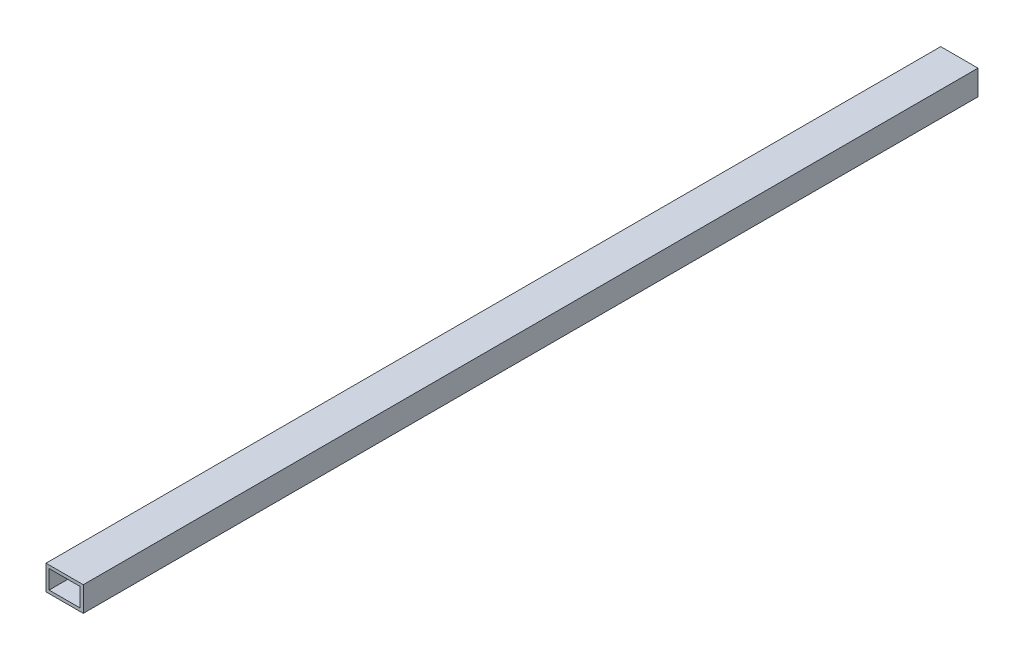
ISO-10303-21;
HEADER;
FILE_DESCRIPTION(('STEP AP214'),'2;1');
FILE_NAME('part.step','',(''),(''),'','','');
FILE_SCHEMA(('AUTOMOTIVE_DESIGN { 1 0 10303 214 1 1 1 1 }'));
ENDSEC;
DATA;
#1=APPLICATION_CONTEXT('core data for automotive mechanical design processes');
#2=APPLICATION_PROTOCOL_DEFINITION('international standard','automotive_design',2000,#1);
#3=PRODUCT_CONTEXT('',#1,'mechanical');
#4=PRODUCT('Part','Part','',(#3));
#5=PRODUCT_RELATED_PRODUCT_CATEGORY('part','',(#4));
#6=PRODUCT_DEFINITION_FORMATION('','',#4);
#7=PRODUCT_DEFINITION_CONTEXT('part definition',#1,'design');
#8=PRODUCT_DEFINITION('design','',#6,#7);
#9=PRODUCT_DEFINITION_SHAPE('','',#8);
#10=(LENGTH_UNIT() NAMED_UNIT(*) SI_UNIT(.MILLI.,.METRE.));
#11=(NAMED_UNIT(*) PLANE_ANGLE_UNIT() SI_UNIT($,.RADIAN.));
#12=(NAMED_UNIT(*) SI_UNIT($,.STERADIAN.) SOLID_ANGLE_UNIT());
#13=UNCERTAINTY_MEASURE_WITH_UNIT(LENGTH_MEASURE(1.E-05),#10,'distance_accuracy_value','');
#14=(GEOMETRIC_REPRESENTATION_CONTEXT(3) GLOBAL_UNCERTAINTY_ASSIGNED_CONTEXT((#13)) GLOBAL_UNIT_ASSIGNED_CONTEXT((#10,
#11,#12)) REPRESENTATION_CONTEXT('',''));
#15=CARTESIAN_POINT('',(0.,0.,0.));
#16=DIRECTION('',(0.,0.,1.));
#17=DIRECTION('',(1.,0.,0.));
#18=AXIS2_PLACEMENT_3D('',#15,#16,#17);
#19=CARTESIAN_POINT('',(0.,0.,457.2));
#20=DIRECTION('',(0.,0.,1.));
#21=DIRECTION('',(1.,0.,0.));
#22=AXIS2_PLACEMENT_3D('',#19,#20,#21);
#23=PLANE('',#22);
#24=DIRECTION('',(0.,-1.,0.));
#25=VECTOR('',#24,1.);
#26=CARTESIAN_POINT('',(-19.05,12.7,457.2));
#27=LINE('',#26,#25);
#28=CARTESIAN_POINT('',(-19.05,12.7,457.2));
#29=VERTEX_POINT('',#28);
#30=CARTESIAN_POINT('',(-19.05,-12.7,457.2));
#31=VERTEX_POINT('',#30);
#32=EDGE_CURVE('E108',#29,#31,#27,.T.);
#33=ORIENTED_EDGE('',*,*,#32,.T.);
#34=DIRECTION('',(1.,0.,0.));
#35=VECTOR('',#34,1.);
#36=CARTESIAN_POINT('',(-19.05,-12.7,457.2));
#37=LINE('',#36,#35);
#38=CARTESIAN_POINT('',(19.05,-12.7,457.2));
#39=VERTEX_POINT('',#38);
#40=EDGE_CURVE('E151',#31,#39,#37,.T.);
#41=ORIENTED_EDGE('',*,*,#40,.T.);
#42=DIRECTION('',(0.,1.,0.));
#43=VECTOR('',#42,1.);
#44=CARTESIAN_POINT('',(19.05,-12.7,457.2));
#45=LINE('',#44,#43);
#46=CARTESIAN_POINT('',(19.05,12.7,457.2));
#47=VERTEX_POINT('',#46);
#48=EDGE_CURVE('E153',#39,#47,#45,.T.);
#49=ORIENTED_EDGE('',*,*,#48,.T.);
#50=DIRECTION('',(-1.,0.,0.));
#51=VECTOR('',#50,1.);
#52=CARTESIAN_POINT('',(19.05,12.7,457.2));
#53=LINE('',#52,#51);
#54=EDGE_CURVE('E55',#47,#29,#53,.T.);
#55=ORIENTED_EDGE('',*,*,#54,.T.);
#56=EDGE_LOOP('',(#33,#41,#49,#55));
#57=FACE_BOUND('',#56,.T.);
#58=DIRECTION('',(1.,0.,0.));
#59=VECTOR('',#58,1.);
#60=CARTESIAN_POINT('',(-15.875,-9.525,457.2));
#61=LINE('',#60,#59);
#62=CARTESIAN_POINT('',(-15.875,-9.525,457.2));
#63=VERTEX_POINT('',#62);
#64=CARTESIAN_POINT('',(15.875,-9.525,457.2));
#65=VERTEX_POINT('',#64);
#66=EDGE_CURVE('E140',#63,#65,#61,.T.);
#67=ORIENTED_EDGE('',*,*,#66,.F.);
#68=DIRECTION('',(0.,-1.,0.));
#69=VECTOR('',#68,1.);
#70=CARTESIAN_POINT('',(-15.875,9.525,457.2));
#71=LINE('',#70,#69);
#72=CARTESIAN_POINT('',(-15.875,9.525,457.2));
#73=VERTEX_POINT('',#72);
#74=EDGE_CURVE('E105',#73,#63,#71,.T.);
#75=ORIENTED_EDGE('',*,*,#74,.F.);
#76=DIRECTION('',(-1.,0.,0.));
#77=VECTOR('',#76,1.);
#78=CARTESIAN_POINT('',(15.875,9.525,457.2));
#79=LINE('',#78,#77);
#80=CARTESIAN_POINT('',(15.875,9.525,457.2));
#81=VERTEX_POINT('',#80);
#82=EDGE_CURVE('E144',#81,#73,#79,.T.);
#83=ORIENTED_EDGE('',*,*,#82,.F.);
#84=DIRECTION('',(0.,1.,0.));
#85=VECTOR('',#84,1.);
#86=CARTESIAN_POINT('',(15.875,-9.525,457.2));
#87=LINE('',#86,#85);
#88=EDGE_CURVE('E142',#65,#81,#87,.T.);
#89=ORIENTED_EDGE('',*,*,#88,.F.);
#90=EDGE_LOOP('',(#67,#75,#83,#89));
#91=FACE_BOUND('',#90,.T.);
#92=ADVANCED_FACE('F32',(#57,#91),#23,.T.);
#93=CARTESIAN_POINT('',(-19.05,12.7,457.2));
#94=DIRECTION('',(1.,0.,0.));
#95=DIRECTION('',(0.,0.,-1.));
#96=AXIS2_PLACEMENT_3D('',#93,#94,#95);
#97=PLANE('',#96);
#98=DIRECTION('',(0.,0.,-1.));
#99=VECTOR('',#98,1.);
#100=CARTESIAN_POINT('',(-19.05,12.7,457.2));
#101=LINE('',#100,#99);
#102=CARTESIAN_POINT('',(-19.05,12.7,-457.2));
#103=VERTEX_POINT('',#102);
#104=EDGE_CURVE('E156',#29,#103,#101,.T.);
#105=ORIENTED_EDGE('',*,*,#104,.T.);
#106=DIRECTION('',(0.,-1.,0.));
#107=VECTOR('',#106,1.);
#108=CARTESIAN_POINT('',(-19.05,12.7,-457.2));
#109=LINE('',#108,#107);
#110=CARTESIAN_POINT('',(-19.05,-12.7,-457.2));
#111=VERTEX_POINT('',#110);
#112=EDGE_CURVE('E127',#103,#111,#109,.T.);
#113=ORIENTED_EDGE('',*,*,#112,.T.);
#114=DIRECTION('',(0.,0.,-1.));
#115=VECTOR('',#114,1.);
#116=CARTESIAN_POINT('',(-19.05,-12.7,457.2));
#117=LINE('',#116,#115);
#118=EDGE_CURVE('E11',#31,#111,#117,.T.);
#119=ORIENTED_EDGE('',*,*,#118,.F.);
#120=ORIENTED_EDGE('',*,*,#32,.F.);
#121=EDGE_LOOP('',(#105,#113,#119,#120));
#122=FACE_BOUND('',#121,.T.);
#123=ADVANCED_FACE('F34',(#122),#97,.F.);
#124=CARTESIAN_POINT('',(-19.05,-12.7,457.2));
#125=DIRECTION('',(0.,1.,0.));
#126=DIRECTION('',(0.,0.,1.));
#127=AXIS2_PLACEMENT_3D('',#124,#125,#126);
#128=PLANE('',#127);
#129=ORIENTED_EDGE('',*,*,#118,.T.);
#130=DIRECTION('',(1.,0.,0.));
#131=VECTOR('',#130,1.);
#132=CARTESIAN_POINT('',(-19.05,-12.7,-457.2));
#133=LINE('',#132,#131);
#134=CARTESIAN_POINT('',(19.05,-12.7,-457.2));
#135=VERTEX_POINT('',#134);
#136=EDGE_CURVE('E130',#111,#135,#133,.T.);
#137=ORIENTED_EDGE('',*,*,#136,.T.);
#138=DIRECTION('',(0.,0.,-1.));
#139=VECTOR('',#138,1.);
#140=CARTESIAN_POINT('',(19.05,-12.7,457.2));
#141=LINE('',#140,#139);
#142=EDGE_CURVE('E40',#39,#135,#141,.T.);
#143=ORIENTED_EDGE('',*,*,#142,.F.);
#144=ORIENTED_EDGE('',*,*,#40,.F.);
#145=EDGE_LOOP('',(#129,#137,#143,#144));
#146=FACE_BOUND('',#145,.T.);
#147=ADVANCED_FACE('F169',(#146),#128,.F.);
#148=CARTESIAN_POINT('',(19.05,-12.7,457.2));
#149=DIRECTION('',(-1.,0.,0.));
#150=DIRECTION('',(0.,-1.,0.));
#151=AXIS2_PLACEMENT_3D('',#148,#149,#150);
#152=PLANE('',#151);
#153=ORIENTED_EDGE('',*,*,#142,.T.);
#154=DIRECTION('',(0.,1.,0.));
#155=VECTOR('',#154,1.);
#156=CARTESIAN_POINT('',(19.05,-12.7,-457.2));
#157=LINE('',#156,#155);
#158=CARTESIAN_POINT('',(19.05,12.7,-457.2));
#159=VERTEX_POINT('',#158);
#160=EDGE_CURVE('E133',#135,#159,#157,.T.);
#161=ORIENTED_EDGE('',*,*,#160,.T.);
#162=DIRECTION('',(0.,0.,-1.));
#163=VECTOR('',#162,1.);
#164=CARTESIAN_POINT('',(19.05,12.7,457.2));
#165=LINE('',#164,#163);
#166=EDGE_CURVE('E158',#47,#159,#165,.T.);
#167=ORIENTED_EDGE('',*,*,#166,.F.);
#168=ORIENTED_EDGE('',*,*,#48,.F.);
#169=EDGE_LOOP('',(#153,#161,#167,#168));
#170=FACE_BOUND('',#169,.T.);
#171=ADVANCED_FACE('F163',(#170),#152,.F.);
#172=CARTESIAN_POINT('',(19.05,12.7,457.2));
#173=DIRECTION('',(0.,-1.,0.));
#174=DIRECTION('',(0.,0.,-1.));
#175=AXIS2_PLACEMENT_3D('',#172,#173,#174);
#176=PLANE('',#175);
#177=ORIENTED_EDGE('',*,*,#166,.T.);
#178=DIRECTION('',(-1.,0.,0.));
#179=VECTOR('',#178,1.);
#180=CARTESIAN_POINT('',(19.05,12.7,-457.2));
#181=LINE('',#180,#179);
#182=EDGE_CURVE('E136',#159,#103,#181,.T.);
#183=ORIENTED_EDGE('',*,*,#182,.T.);
#184=ORIENTED_EDGE('',*,*,#104,.F.);
#185=ORIENTED_EDGE('',*,*,#54,.F.);
#186=EDGE_LOOP('',(#177,#183,#184,#185));
#187=FACE_BOUND('',#186,.T.);
#188=ADVANCED_FACE('F174',(#187),#176,.F.);
#189=CARTESIAN_POINT('',(-15.875,9.525,457.2));
#190=DIRECTION('',(1.,0.,0.));
#191=DIRECTION('',(0.,1.,0.));
#192=AXIS2_PLACEMENT_3D('',#189,#190,#191);
#193=PLANE('',#192);
#194=DIRECTION('',(0.,0.,-1.));
#195=VECTOR('',#194,1.);
#196=CARTESIAN_POINT('',(-15.875,-9.525,457.2));
#197=LINE('',#196,#195);
#198=CARTESIAN_POINT('',(-15.875,-9.525,-457.2));
#199=VERTEX_POINT('',#198);
#200=EDGE_CURVE('E97',#63,#199,#197,.T.);
#201=ORIENTED_EDGE('',*,*,#200,.T.);
#202=DIRECTION('',(0.,-1.,0.));
#203=VECTOR('',#202,1.);
#204=CARTESIAN_POINT('',(-15.875,9.525,-457.2));
#205=LINE('',#204,#203);
#206=CARTESIAN_POINT('',(-15.875,9.525,-457.2));
#207=VERTEX_POINT('',#206);
#208=EDGE_CURVE('E102',#207,#199,#205,.T.);
#209=ORIENTED_EDGE('',*,*,#208,.F.);
#210=DIRECTION('',(0.,0.,-1.));
#211=VECTOR('',#210,1.);
#212=CARTESIAN_POINT('',(-15.875,9.525,457.2));
#213=LINE('',#212,#211);
#214=EDGE_CURVE('E146',#73,#207,#213,.T.);
#215=ORIENTED_EDGE('',*,*,#214,.F.);
#216=ORIENTED_EDGE('',*,*,#74,.T.);
#217=EDGE_LOOP('',(#201,#209,#215,#216));
#218=FACE_BOUND('',#217,.T.);
#219=ADVANCED_FACE('F99',(#218),#193,.T.);
#220=CARTESIAN_POINT('',(-15.875,-9.525,457.2));
#221=DIRECTION('',(0.,1.,0.));
#222=DIRECTION('',(0.,0.,1.));
#223=AXIS2_PLACEMENT_3D('',#220,#221,#222);
#224=PLANE('',#223);
#225=DIRECTION('',(0.,0.,-1.));
#226=VECTOR('',#225,1.);
#227=CARTESIAN_POINT('',(15.875,-9.525,457.2));
#228=LINE('',#227,#226);
#229=CARTESIAN_POINT('',(15.875,-9.525,-457.2));
#230=VERTEX_POINT('',#229);
#231=EDGE_CURVE('E109',#65,#230,#228,.T.);
#232=ORIENTED_EDGE('',*,*,#231,.T.);
#233=DIRECTION('',(1.,0.,0.));
#234=VECTOR('',#233,1.);
#235=CARTESIAN_POINT('',(-15.875,-9.525,-457.2));
#236=LINE('',#235,#234);
#237=EDGE_CURVE('E112',#199,#230,#236,.T.);
#238=ORIENTED_EDGE('',*,*,#237,.F.);
#239=ORIENTED_EDGE('',*,*,#200,.F.);
#240=ORIENTED_EDGE('',*,*,#66,.T.);
#241=EDGE_LOOP('',(#232,#238,#239,#240));
#242=FACE_BOUND('',#241,.T.);
#243=ADVANCED_FACE('F113',(#242),#224,.T.);
#244=CARTESIAN_POINT('',(15.875,-9.525,457.2));
#245=DIRECTION('',(-1.,0.,0.));
#246=DIRECTION('',(0.,-1.,0.));
#247=AXIS2_PLACEMENT_3D('',#244,#245,#246);
#248=PLANE('',#247);
#249=DIRECTION('',(0.,0.,-1.));
#250=VECTOR('',#249,1.);
#251=CARTESIAN_POINT('',(15.875,9.525,457.2));
#252=LINE('',#251,#250);
#253=CARTESIAN_POINT('',(15.875,9.525,-457.2));
#254=VERTEX_POINT('',#253);
#255=EDGE_CURVE('E47',#81,#254,#252,.T.);
#256=ORIENTED_EDGE('',*,*,#255,.T.);
#257=DIRECTION('',(0.,1.,0.));
#258=VECTOR('',#257,1.);
#259=CARTESIAN_POINT('',(15.875,-9.525,-457.2));
#260=LINE('',#259,#258);
#261=EDGE_CURVE('E118',#230,#254,#260,.T.);
#262=ORIENTED_EDGE('',*,*,#261,.F.);
#263=ORIENTED_EDGE('',*,*,#231,.F.);
#264=ORIENTED_EDGE('',*,*,#88,.T.);
#265=EDGE_LOOP('',(#256,#262,#263,#264));
#266=FACE_BOUND('',#265,.T.);
#267=ADVANCED_FACE('F192',(#266),#248,.T.);
#268=CARTESIAN_POINT('',(15.875,9.525,457.2));
#269=DIRECTION('',(0.,-1.,0.));
#270=DIRECTION('',(0.,0.,-1.));
#271=AXIS2_PLACEMENT_3D('',#268,#269,#270);
#272=PLANE('',#271);
#273=ORIENTED_EDGE('',*,*,#214,.T.);
#274=DIRECTION('',(-1.,0.,0.));
#275=VECTOR('',#274,1.);
#276=CARTESIAN_POINT('',(15.875,9.525,-457.2));
#277=LINE('',#276,#275);
#278=EDGE_CURVE('E122',#254,#207,#277,.T.);
#279=ORIENTED_EDGE('',*,*,#278,.F.);
#280=ORIENTED_EDGE('',*,*,#255,.F.);
#281=ORIENTED_EDGE('',*,*,#82,.T.);
#282=EDGE_LOOP('',(#273,#279,#280,#281));
#283=FACE_BOUND('',#282,.T.);
#284=ADVANCED_FACE('F195',(#283),#272,.T.);
#285=CARTESIAN_POINT('',(0.,0.,-457.2));
#286=DIRECTION('',(0.,0.,1.));
#287=DIRECTION('',(1.,0.,0.));
#288=AXIS2_PLACEMENT_3D('',#285,#286,#287);
#289=PLANE('',#288);
#290=ORIENTED_EDGE('',*,*,#278,.T.);
#291=ORIENTED_EDGE('',*,*,#208,.T.);
#292=ORIENTED_EDGE('',*,*,#237,.T.);
#293=ORIENTED_EDGE('',*,*,#261,.T.);
#294=EDGE_LOOP('',(#290,#291,#292,#293));
#295=FACE_BOUND('',#294,.T.);
#296=ORIENTED_EDGE('',*,*,#112,.F.);
#297=ORIENTED_EDGE('',*,*,#182,.F.);
#298=ORIENTED_EDGE('',*,*,#160,.F.);
#299=ORIENTED_EDGE('',*,*,#136,.F.);
#300=EDGE_LOOP('',(#296,#297,#298,#299));
#301=FACE_BOUND('',#300,.T.);
#302=ADVANCED_FACE('F120',(#295,#301),#289,.F.);
#303=CLOSED_SHELL('',(#92,#123,#147,#171,#188,#219,#243,#267,#284,#302));
#304=MANIFOLD_SOLID_BREP('B2',#303);
#305=ADVANCED_BREP_SHAPE_REPRESENTATION('',(#18,#304),#14);
#306=SHAPE_DEFINITION_REPRESENTATION(#9,#305);
ENDSEC;
END-ISO-10303-21;
